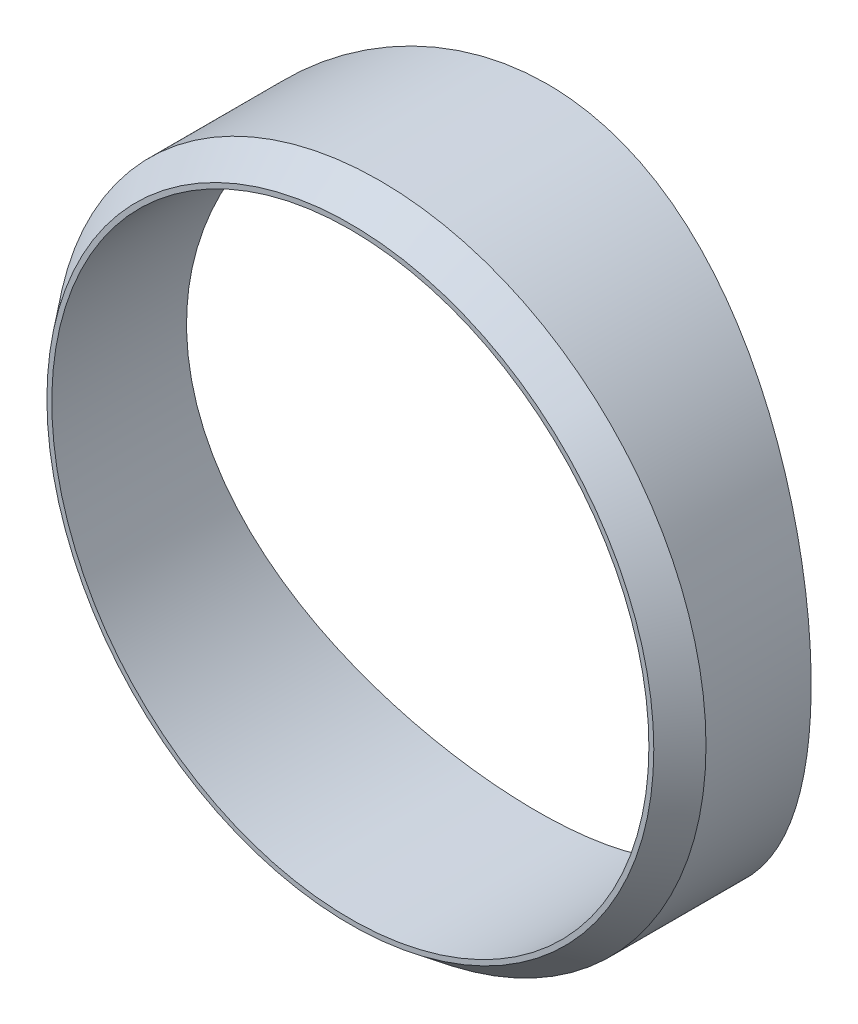
ISO-10303-21;
HEADER;
FILE_DESCRIPTION(('STEP AP214'),'2;1');
FILE_NAME('part.step','',(''),(''),'','','');
FILE_SCHEMA(('AUTOMOTIVE_DESIGN { 1 0 10303 214 1 1 1 1 }'));
ENDSEC;
DATA;
#1=APPLICATION_CONTEXT('core data for automotive mechanical design processes');
#2=APPLICATION_PROTOCOL_DEFINITION('international standard','automotive_design',2000,#1);
#3=PRODUCT_CONTEXT('',#1,'mechanical');
#4=PRODUCT('Part','Part','',(#3));
#5=PRODUCT_RELATED_PRODUCT_CATEGORY('part','',(#4));
#6=PRODUCT_DEFINITION_FORMATION('','',#4);
#7=PRODUCT_DEFINITION_CONTEXT('part definition',#1,'design');
#8=PRODUCT_DEFINITION('design','',#6,#7);
#9=PRODUCT_DEFINITION_SHAPE('','',#8);
#10=(LENGTH_UNIT() NAMED_UNIT(*) SI_UNIT(.MILLI.,.METRE.));
#11=(NAMED_UNIT(*) PLANE_ANGLE_UNIT() SI_UNIT($,.RADIAN.));
#12=(NAMED_UNIT(*) SI_UNIT($,.STERADIAN.) SOLID_ANGLE_UNIT());
#13=UNCERTAINTY_MEASURE_WITH_UNIT(LENGTH_MEASURE(1.E-05),#10,'distance_accuracy_value','');
#14=(GEOMETRIC_REPRESENTATION_CONTEXT(3) GLOBAL_UNCERTAINTY_ASSIGNED_CONTEXT((#13)) GLOBAL_UNIT_ASSIGNED_CONTEXT((#10,
#11,#12)) REPRESENTATION_CONTEXT('',''));
#15=CARTESIAN_POINT('',(0.,0.,0.));
#16=DIRECTION('',(0.,0.,1.));
#17=DIRECTION('',(1.,0.,0.));
#18=AXIS2_PLACEMENT_3D('',#15,#16,#17);
#19=CARTESIAN_POINT('',(0.,0.,25.4));
#20=DIRECTION('',(0.,0.,1.));
#21=DIRECTION('',(1.,0.,0.));
#22=AXIS2_PLACEMENT_3D('',#19,#20,#21);
#23=PLANE('',#22);
#24=CARTESIAN_POINT('',(0.,0.,25.4));
#25=DIRECTION('',(0.,0.,1.));
#26=DIRECTION('',(1.,0.,0.));
#27=AXIS2_PLACEMENT_3D('',#24,#25,#26);
#28=CIRCLE('',#27,78.2904683516004);
#29=CARTESIAN_POINT('',(78.2904683516004,0.,25.4));
#30=VERTEX_POINT('',#29);
#31=EDGE_CURVE('E48',#30,#30,#28,.T.);
#32=ORIENTED_EDGE('',*,*,#31,.T.);
#33=EDGE_LOOP('',(#32));
#34=FACE_BOUND('',#33,.T.);
#35=CARTESIAN_POINT('',(0.,0.,25.4));
#36=DIRECTION('',(0.,0.,1.));
#37=DIRECTION('',(1.,0.,0.));
#38=AXIS2_PLACEMENT_3D('',#35,#36,#37);
#39=CIRCLE('',#38,77.0255);
#40=CARTESIAN_POINT('',(77.0255,0.,25.4));
#41=VERTEX_POINT('',#40);
#42=EDGE_CURVE('E52',#41,#41,#39,.T.);
#43=ORIENTED_EDGE('',*,*,#42,.F.);
#44=EDGE_LOOP('',(#43));
#45=FACE_BOUND('',#44,.T.);
#46=ADVANCED_FACE('F33',(#34,#45),#23,.T.);
#47=CARTESIAN_POINT('',(0.,0.,25.4));
#48=DIRECTION('',(0.,0.,-1.));
#49=DIRECTION('',(-1.,0.,0.));
#50=AXIS2_PLACEMENT_3D('',#47,#48,#49);
#51=CYLINDRICAL_SURFACE('',#50,84.1375);
#52=CARTESIAN_POINT('',(0.,0.,17.78));
#53=DIRECTION('',(0.,0.,1.));
#54=DIRECTION('',(1.,0.,0.));
#55=AXIS2_PLACEMENT_3D('',#52,#53,#54);
#56=CIRCLE('',#55,84.1375);
#57=CARTESIAN_POINT('',(84.1375,0.,17.78));
#58=VERTEX_POINT('',#57);
#59=EDGE_CURVE('E44',#58,#58,#56,.F.);
#60=ORIENTED_EDGE('',*,*,#59,.T.);
#61=EDGE_LOOP('',(#60));
#62=FACE_BOUND('',#61,.T.);
#63=CARTESIAN_POINT('',(0.,84.1375,-25.4));
#64=CARTESIAN_POINT('',(-1.13579836737406,84.1374987840637,-25.3999989112412));
#65=CARTESIAN_POINT('',(-2.27166347939818,84.1144942440966,-25.3908888684016));
#66=CARTESIAN_POINT('',(-4.5413655448755,84.0225280340937,-25.3545196277505));
#67=CARTESIAN_POINT('',(-5.67520218700877,83.9535598304427,-25.3272578497176));
#68=CARTESIAN_POINT('',(-7.93906733420635,83.7698055382193,-25.2547956784839));
#69=CARTESIAN_POINT('',(-9.06909404595136,83.6550002770221,-25.2095877788638));
#70=CARTESIAN_POINT('',(-11.3228582922426,83.3798580755251,-25.1016017909872));
#71=CARTESIAN_POINT('',(-12.4465951722919,83.2195164835045,-25.0388219076908));
#72=CARTESIAN_POINT('',(-14.687826825913,82.8533553916742,-24.8960668968613));
#73=CARTESIAN_POINT('',(-15.8053048243469,82.6474464311462,-24.8160579525927));
#74=CARTESIAN_POINT('',(-18.0298682211291,82.1908279167666,-24.6395588016407));
#75=CARTESIAN_POINT('',(-19.1369525737826,81.9401139049008,-24.5430669549833));
#76=CARTESIAN_POINT('',(-21.3384219862647,81.3945721825672,-24.334402338982));
#77=CARTESIAN_POINT('',(-22.4328099576857,81.0997548105296,-24.222233245003));
#78=CARTESIAN_POINT('',(-24.6073995213569,80.4666226235838,-23.9830641617644));
#79=CARTESIAN_POINT('',(-25.6875997343616,80.1283036137102,-23.8560627422972));
#80=CARTESIAN_POINT('',(-27.8283473590047,79.4101527096415,-23.5886603390106));
#81=CARTESIAN_POINT('',(-28.8889484330848,79.0304634974695,-23.4483056094626));
#82=CARTESIAN_POINT('',(-30.9926172364742,78.2294287763831,-23.1548751080098));
#83=CARTESIAN_POINT('',(-32.035683322252,77.8080793879044,-23.0017981515717));
#84=CARTESIAN_POINT('',(-34.1025422857283,76.924628009252,-22.6840569488801));
#85=CARTESIAN_POINT('',(-35.1263364968086,76.4625288511407,-22.5193935080345));
#86=CARTESIAN_POINT('',(-37.1532401623122,75.4984477943863,-22.1796436481665));
#87=CARTESIAN_POINT('',(-38.1563477289527,74.9964622759767,-22.0045562835146));
#88=CARTESIAN_POINT('',(-41.1317129614006,73.432412175596,-21.4656034123779));
#89=CARTESIAN_POINT('',(-43.0711097442513,72.3117847619165,-21.0878764904726));
#90=CARTESIAN_POINT('',(-46.8504229710171,69.922506389119,-20.3057673209889));
#91=CARTESIAN_POINT('',(-48.6903370352126,68.653851891345,-19.901384436288));
#92=CARTESIAN_POINT('',(-52.3393653427279,65.9176320858619,-19.0582810971339));
#93=CARTESIAN_POINT('',(-54.1436155400303,64.4437950791801,-18.6188323602827));
#94=CARTESIAN_POINT('',(-57.6230027707126,61.3524634359866,-17.7341223746852));
#95=CARTESIAN_POINT('',(-59.2981362769925,59.7349648776468,-17.2888609675415));
#96=CARTESIAN_POINT('',(-62.5098428824084,56.3653875694754,-16.4041984293871));
#97=CARTESIAN_POINT('',(-64.0463773765926,54.6132715738148,-15.9647989600051));
#98=CARTESIAN_POINT('',(-66.970745032512,50.9849730169014,-15.1034937234226));
#99=CARTESIAN_POINT('',(-68.3585764162773,49.1087889726618,-14.6815881654253));
#100=CARTESIAN_POINT('',(-71.0189275265081,45.1800905052203,-13.8529946686391));
#101=CARTESIAN_POINT('',(-72.286202378091,43.123818821571,-13.4472534476534));
#102=CARTESIAN_POINT('',(-74.6421793061311,38.9037758076143,-12.6776376927333));
#103=CARTESIAN_POINT('',(-75.7308763561487,36.7400014536559,-12.3137643373422));
#104=CARTESIAN_POINT('',(-77.7199345214605,32.3202929751587,-11.6384254032149));
#105=CARTESIAN_POINT('',(-78.6203457330794,30.0643835559886,-11.3269458886218));
#106=CARTESIAN_POINT('',(-80.2245736291031,25.4762971916758,-10.7654331735866));
#107=CARTESIAN_POINT('',(-80.928400762305,23.1441243074365,-10.5153967074209));
#108=CARTESIAN_POINT('',(-82.1071360001626,18.5200050119321,-10.0932510716333));
#109=CARTESIAN_POINT('',(-82.5903644747553,16.2304350304875,-9.91832768147827));
#110=CARTESIAN_POINT('',(-83.3647917783705,11.6148830325373,-9.63670374553288));
#111=CARTESIAN_POINT('',(-83.6559954776382,9.28890194104357,-9.53000146948064));
#112=CARTESIAN_POINT('',(-84.043259569311,4.61920656207157,-9.38788884352235));
#113=CARTESIAN_POINT('',(-84.1393724712354,2.27549721673988,-9.35245931027685));
#114=CARTESIAN_POINT('',(-84.1355724006608,-2.41170802730963,-9.35385871613906));
#115=CARTESIAN_POINT('',(-84.0356651067709,-4.75520393024392,-9.39068556201487));
#116=CARTESIAN_POINT('',(-83.650367000701,-9.31187473144274,-9.53205712091199));
#117=CARTESIAN_POINT('',(-83.374062677545,-11.5259282506201,-9.63328366028779));
#118=CARTESIAN_POINT('',(-82.6473759889379,-15.9214309689536,-9.8976395519719));
#119=CARTESIAN_POINT('',(-82.1970001883284,-18.1028813944638,-10.0607665697934));
#120=CARTESIAN_POINT('',(-81.1262784370296,-22.4184991885229,-10.4447651179993));
#121=CARTESIAN_POINT('',(-80.5059254134601,-24.5526645855112,-10.6656390512589));
#122=CARTESIAN_POINT('',(-79.1006217724851,-28.7598641521006,-11.1595929272724));
#123=CARTESIAN_POINT('',(-78.3156669773701,-30.8328967685848,-11.43267419507));
#124=CARTESIAN_POINT('',(-76.5750961739525,-34.9343300603699,-12.0285851607627));
#125=CARTESIAN_POINT('',(-75.6171943980202,-36.961664494246,-12.3520720677581));
#126=CARTESIAN_POINT('',(-73.5458844249812,-40.9283319176619,-13.0378680753494));
#127=CARTESIAN_POINT('',(-72.4324756422538,-42.8676645757611,-13.4001773221444));
#128=CARTESIAN_POINT('',(-70.0576808925509,-46.647869919291,-14.1549086565952));
#129=CARTESIAN_POINT('',(-68.7962635896192,-48.4887216340615,-14.5473371149027));
#130=CARTESIAN_POINT('',(-66.1337110568633,-52.0616516468965,-15.3528368594222));
#131=CARTESIAN_POINT('',(-64.7325708619257,-53.793726075946,-15.7659088789519));
#132=CARTESIAN_POINT('',(-61.7159288217967,-57.2345058220655,-16.6264869294176));
#133=CARTESIAN_POINT('',(-60.0927896938098,-58.9363668857597,-17.0746201497227));
#134=CARTESIAN_POINT('',(-56.709858338175,-62.1983392798318,-17.970902553977));
#135=CARTESIAN_POINT('',(-54.9500602010555,-63.7584444739998,-18.4190517377781));
#136=CARTESIAN_POINT('',(-51.3029810974419,-66.7282093995578,-19.3034111053287));
#137=CARTESIAN_POINT('',(-49.4156355895307,-68.1377920186662,-19.7396150853114));
#138=CARTESIAN_POINT('',(-46.4986297626232,-70.1311969166396,-20.3754339818483));
#139=CARTESIAN_POINT('',(-45.5118379767763,-70.775574722811,-20.5843167155275));
#140=CARTESIAN_POINT('',(-43.5109337707891,-72.0229607580395,-20.9944338117443));
#141=CARTESIAN_POINT('',(-42.4968239288505,-72.6259728721568,-21.1956688917545));
#142=CARTESIAN_POINT('',(-40.4208288949557,-73.8019586117516,-21.5932070556042));
#143=CARTESIAN_POINT('',(-39.3583857690624,-74.3740137274549,-21.789312550928));
#144=CARTESIAN_POINT('',(-37.2083910011222,-75.4725889035402,-22.1704194159273));
#145=CARTESIAN_POINT('',(-36.1208418791483,-75.9991135091903,-22.3554218934412));
#146=CARTESIAN_POINT('',(-33.9220893424511,-77.0056688048626,-22.7128824055031));
#147=CARTESIAN_POINT('',(-32.8108803562794,-77.4856883927809,-22.8853374421762));
#148=CARTESIAN_POINT('',(-30.567100128933,-78.3979451761015,-23.2161990531302));
#149=CARTESIAN_POINT('',(-29.4345312279917,-78.8301875708714,-23.3746071557012));
#150=CARTESIAN_POINT('',(-27.1516354210934,-79.6453038220187,-23.6758189545095));
#151=CARTESIAN_POINT('',(-26.0013372819479,-80.028249806583,-23.8186454012916));
#152=CARTESIAN_POINT('',(-23.6836119518397,-80.744513572846,-24.0877007515908));
#153=CARTESIAN_POINT('',(-22.5161866812279,-81.0778368723877,-24.2139315003001));
#154=CARTESIAN_POINT('',(-20.1667514082667,-81.6939125844686,-24.4486447153511));
#155=CARTESIAN_POINT('',(-18.9847468031049,-81.9766831442725,-24.5571335494328));
#156=CARTESIAN_POINT('',(-16.6082269031161,-82.4909910284157,-24.7554181564164));
#157=CARTESIAN_POINT('',(-15.413713077128,-82.7225342987846,-24.8452160987267));
#158=CARTESIAN_POINT('',(-13.0418493613665,-83.1290781772235,-25.0034767709064));
#159=CARTESIAN_POINT('',(-11.864729083103,-83.3052475841439,-25.0723792599091));
#160=CARTESIAN_POINT('',(-9.50332142450741,-83.6075501353561,-25.1909249271593));
#161=CARTESIAN_POINT('',(-8.31903533426058,-83.7336920292335,-25.2405714731506));
#162=CARTESIAN_POINT('',(-5.94682866392396,-83.9355083362186,-25.3201264868808));
#163=CARTESIAN_POINT('',(-4.75891356764466,-84.0112385356098,-25.3500567725246));
#164=CARTESIAN_POINT('',(-2.38067415004954,-84.1122336870929,-25.3899933759974));
#165=CARTESIAN_POINT('',(-1.19034994515306,-84.1375010221249,-25.4000006346247));
#166=CARTESIAN_POINT('',(1.2064754251597,-84.1374989640286,-25.3999993567782));
#167=CARTESIAN_POINT('',(2.41297729269802,-84.1115403209579,-25.389717833034));
#168=CARTESIAN_POINT('',(4.22091326998973,-84.0337252292689,-25.3589494076985));
#169=CARTESIAN_POINT('',(4.82338211423127,-84.001296449053,-25.3461312716307));
#170=CARTESIAN_POINT('',(6.0274540845004,-83.923493200343,-25.315407506633));
#171=CARTESIAN_POINT('',(6.62905705380394,-83.8781166273751,-25.2975010506733));
#172=CARTESIAN_POINT('',(8.33085195885286,-83.7313351166958,-25.2396464044549));
#173=CARTESIAN_POINT('',(9.42957198024638,-83.6147196715556,-25.1937525161567));
#174=CARTESIAN_POINT('',(11.6208774826451,-83.3384300515371,-25.0853776220322));
#175=CARTESIAN_POINT('',(12.7134621155921,-83.1787500667184,-25.0228943781138));
#176=CARTESIAN_POINT('',(14.8909521759895,-82.8166472694777,-24.8817976516025));
#177=CARTESIAN_POINT('',(15.9758542094698,-82.6142066523683,-24.8031774502842));
#178=CARTESIAN_POINT('',(18.1357676783897,-82.1670813544746,-24.6304164433531));
#179=CARTESIAN_POINT('',(19.2107782085816,-81.9223928469758,-24.536274231828));
#180=CARTESIAN_POINT('',(21.3510842162468,-81.3908367030825,-24.3329887472587));
#181=CARTESIAN_POINT('',(22.416357186758,-81.1038893092892,-24.2238171344195));
#182=CARTESIAN_POINT('',(24.5333923696353,-80.4887981539502,-23.9914199535691));
#183=CARTESIAN_POINT('',(25.5851544990723,-80.1606541396745,-23.8681942993407));
#184=CARTESIAN_POINT('',(27.6734342288918,-79.4639002111979,-23.608597393834));
#185=CARTESIAN_POINT('',(28.7099531665223,-79.095293870963,-23.4722273037101));
#186=CARTESIAN_POINT('',(30.766204241882,-78.3183723875131,-23.1873142711305));
#187=CARTESIAN_POINT('',(31.785937630837,-77.9100602198606,-23.0387722409733));
#188=CARTESIAN_POINT('',(33.8251383343548,-77.0469103034505,-22.727807088882));
#189=CARTESIAN_POINT('',(34.8442804421776,-76.5913760691221,-22.5651845656317));
#190=CARTESIAN_POINT('',(36.8621852871375,-75.6408754336677,-22.2295480248669));
#191=CARTESIAN_POINT('',(37.8609490715736,-75.1459110654109,-22.0565345431841));
#192=CARTESIAN_POINT('',(39.8367149341125,-74.1174422168748,-21.7013033241531));
#193=CARTESIAN_POINT('',(40.8137179949538,-73.5839394816671,-21.51908600368));
#194=CARTESIAN_POINT('',(42.7448094892143,-72.4792253130799,-21.1466412752471));
#195=CARTESIAN_POINT('',(43.6988930473624,-71.908005952079,-20.9564121863638));
#196=CARTESIAN_POINT('',(46.5239121673113,-70.1397052293876,-20.3757580073506));
#197=CARTESIAN_POINT('',(48.3586268299631,-68.8874546501574,-19.9751822432552));
#198=CARTESIAN_POINT('',(51.9210186787804,-66.2438456532081,-19.1572933852868));
#199=CARTESIAN_POINT('',(53.6486912155191,-64.8524811998613,-18.7399795656834));
#200=CARTESIAN_POINT('',(56.2071057569245,-62.6200685580884,-18.095605597421));
#201=CARTESIAN_POINT('',(57.0796232857716,-61.8257823559038,-17.8707933365855));
#202=CARTESIAN_POINT('',(58.790303962265,-60.2014096331592,-17.4209285905839));
#203=CARTESIAN_POINT('',(59.6284749216728,-59.3713313422621,-17.195876172121));
#204=CARTESIAN_POINT('',(61.269435342197,-57.6763978919289,-16.7469965149714));
#205=CARTESIAN_POINT('',(62.0722202084451,-56.8115382438691,-16.5231694386803));
#206=CARTESIAN_POINT('',(63.6410942462141,-55.0483660732008,-16.0782650192627));
#207=CARTESIAN_POINT('',(64.4071812034094,-54.1500515377468,-15.8571878426577));
#208=CARTESIAN_POINT('',(65.9014846936324,-52.3211991227096,-15.4192494654582));
#209=CARTESIAN_POINT('',(66.6296947491209,-51.3906557765316,-15.2023889899302));
#210=CARTESIAN_POINT('',(68.0469326831533,-49.4987968360999,-14.7743645899035));
#211=CARTESIAN_POINT('',(68.7359573129536,-48.5374787006988,-14.5632011384885));
#212=CARTESIAN_POINT('',(70.0735159391062,-46.5856297456182,-14.1480225645822));
#213=CARTESIAN_POINT('',(70.7220515988819,-45.5951001285098,-13.944007148577));
#214=CARTESIAN_POINT('',(71.9774631335714,-43.5863111639921,-13.5444989246959));
#215=CARTESIAN_POINT('',(72.5843391654383,-42.5680519210747,-13.3490060847121));
#216=CARTESIAN_POINT('',(73.7637580593547,-40.4904236201499,-12.9651099232105));
#217=CARTESIAN_POINT('',(74.3356749779068,-39.430672443693,-12.7768506290644));
#218=CARTESIAN_POINT('',(75.4341795052027,-37.2861204580077,-12.4118263212716));
#219=CARTESIAN_POINT('',(75.9607714136656,-36.2013220372748,-12.2350602177232));
#220=CARTESIAN_POINT('',(76.9675989808587,-34.0082866605201,-11.8942451356092));
#221=CARTESIAN_POINT('',(77.4478287327534,-32.9000467397715,-11.7301977780161));
#222=CARTESIAN_POINT('',(78.3607052599883,-30.6623349026154,-11.4160491145323));
#223=CARTESIAN_POINT('',(78.793357208823,-29.5328653103407,-11.2659462926226));
#224=CARTESIAN_POINT('',(79.6100026396272,-27.2549081432356,-10.9807998123428));
#225=CARTESIAN_POINT('',(79.9940079628619,-26.1064252737579,-10.8457524902186));
#226=CARTESIAN_POINT('',(80.7124888964821,-23.7924473810083,-10.5916876684995));
#227=CARTESIAN_POINT('',(81.0469696582554,-22.6269541409752,-10.4726685018233));
#228=CARTESIAN_POINT('',(81.6655863305325,-20.2810841339025,-10.2515335282699));
#229=CARTESIAN_POINT('',(81.9497218655443,-19.100707255926,-10.149417847465));
#230=CARTESIAN_POINT('',(82.4668835636429,-16.7274309059156,-9.96286444334243));
#231=CARTESIAN_POINT('',(82.6999103285937,-15.5345315815211,-9.87842651184963));
#232=CARTESIAN_POINT('',(83.1035324540777,-13.2004281866834,-9.73175474896208));
#233=CARTESIAN_POINT('',(83.2767277393433,-12.0597307842497,-9.66860038944896));
#234=CARTESIAN_POINT('',(83.57615030259,-9.77127272290287,-9.55920290470898));
#235=CARTESIAN_POINT('',(83.7023734645743,-8.62351145396255,-9.51296126148824));
#236=CARTESIAN_POINT('',(83.9074919630852,-6.32334896358762,-9.43772444696079));
#237=CARTESIAN_POINT('',(83.9863932230448,-5.17094834106291,-9.40872711713241));
#238=CARTESIAN_POINT('',(84.0966933838927,-2.8634540447277,-9.36817058195371));
#239=CARTESIAN_POINT('',(84.1280875832586,-1.70836011570275,-9.35661310253336));
#240=CARTESIAN_POINT('',(84.1432747714452,0.601907962464761,-9.35102347673595));
#241=CARTESIAN_POINT('',(84.127079089475,1.75708202706065,-9.35698715928496));
#242=CARTESIAN_POINT('',(84.0471531366509,4.06556686782429,-9.38638911474745));
#243=CARTESIAN_POINT('',(83.9834226378726,5.21887763503115,-9.40982747145011));
#244=CARTESIAN_POINT('',(83.8085946146548,7.52139596202885,-9.47401411116958));
#245=CARTESIAN_POINT('',(83.6974979754726,8.6706035981011,-9.51476207067562));
#246=CARTESIAN_POINT('',(83.4282235462257,10.962756553736,-9.61328402789944));
#247=CARTESIAN_POINT('',(83.2700457628858,12.105701874193,-9.67105802318536));
#248=CARTESIAN_POINT('',(82.9137059458647,14.3411901522644,-9.80079352646058));
#249=CARTESIAN_POINT('',(82.7172330357099,15.4340378088037,-9.87215344670397));
#250=CARTESIAN_POINT('',(82.2814238557938,17.61015758173,-10.029844802115));
#251=CARTESIAN_POINT('',(82.042084034607,18.69342889693,-10.1161774777223));
#252=CARTESIAN_POINT('',(81.5211240039484,20.8483540820473,-10.3032517333322));
#253=CARTESIAN_POINT('',(81.239509013617,21.9200093685512,-10.4039915346103));
#254=CARTESIAN_POINT('',(80.634569870303,24.0501789114883,-10.6192643221436));
#255=CARTESIAN_POINT('',(80.3112418907098,25.1086919525174,-10.7337985737915));
#256=CARTESIAN_POINT('',(79.6235752297204,27.2108063051721,-10.9759446799994));
#257=CARTESIAN_POINT('',(79.2592366622794,28.2544076582234,-11.103556498221));
#258=CARTESIAN_POINT('',(78.4903006905153,30.3251031801363,-11.3710695276365));
#259=CARTESIAN_POINT('',(78.085699724053,31.3521958790723,-11.5109718260787));
#260=CARTESIAN_POINT('',(76.8127197486863,34.4062171367643,-11.9478435503395));
#261=CARTESIAN_POINT('',(75.8850125264679,36.4063502180648,-12.2620315085854));
#262=CARTESIAN_POINT('',(73.8496307870749,40.3791717188042,-12.9383454063673));
#263=CARTESIAN_POINT('',(72.7375216548759,42.3493869428777,-13.3015963177496));
#264=CARTESIAN_POINT('',(70.3614395019796,46.189660605753,-14.0596344974458));
#265=CARTESIAN_POINT('',(69.0974643225119,48.0597176202629,-14.4544222140275));
#266=CARTESIAN_POINT('',(66.4257269613256,51.6896695943338,-15.2659280173345));
#267=CARTESIAN_POINT('',(65.0179324634176,53.4495396509794,-15.6826510226753));
#268=CARTESIAN_POINT('',(62.0673050973267,56.8492274279432,-16.5277801778101));
#269=CARTESIAN_POINT('',(60.5244679689937,58.4890413578871,-16.9561866958868));
#270=CARTESIAN_POINT('',(57.2231109825551,61.7274260080137,-17.8380512526608));
#271=CARTESIAN_POINT('',(55.4573646479106,63.3186140940334,-18.2915757486493));
#272=CARTESIAN_POINT('',(51.7955361336954,66.3474604928405,-19.1873630085978));
#273=CARTESIAN_POINT('',(49.8994476974666,67.7851114270951,-19.6296252305498));
#274=CARTESIAN_POINT('',(46.9662422985571,69.8191184342494,-20.2750437090292));
#275=CARTESIAN_POINT('',(45.973216726005,70.4769650108824,-20.4872745453053));
#276=CARTESIAN_POINT('',(43.9590169239977,71.7505603694797,-20.9041546027418));
#277=CARTESIAN_POINT('',(42.9378454344397,72.3663132289388,-21.1088045573576));
#278=CARTESIAN_POINT('',(40.8688558566642,73.5545983763756,-21.5089893429343));
#279=CARTESIAN_POINT('',(39.8210362908345,74.1271282606619,-21.7045236667309));
#280=CARTESIAN_POINT('',(37.7005470018114,75.2277502965145,-22.0849377263878));
#281=CARTESIAN_POINT('',(36.6278798045674,75.7558469399919,-22.2698185386518));
#282=CARTESIAN_POINT('',(34.4551078646593,76.768526557683,-22.6281782406268));
#283=CARTESIAN_POINT('',(33.3549123408878,77.2529315715017,-22.8016097902029));
#284=CARTESIAN_POINT('',(31.1331181552372,78.1747672075468,-23.1348396400622));
#285=CARTESIAN_POINT('',(30.0115217598515,78.6122027719836,-23.2946393743451));
#286=CARTESIAN_POINT('',(27.7484786574042,79.4392381480523,-23.5993251788598));
#287=CARTESIAN_POINT('',(26.6070266618078,79.8288249853754,-23.744207202401));
#288=CARTESIAN_POINT('',(24.3067777201468,80.5590179092085,-24.0177458886759));
#289=CARTESIAN_POINT('',(23.1479827004696,80.8996293917564,-24.1464043387085));
#290=CARTESIAN_POINT('',(20.8179497033487,81.5302706311923,-24.3860902940861));
#291=CARTESIAN_POINT('',(19.6467487276985,81.8204210814626,-24.4971598102905));
#292=CARTESIAN_POINT('',(17.2915616363778,82.3503340866718,-24.7010372909377));
#293=CARTESIAN_POINT('',(16.1075770048952,82.5901024262429,-24.7938473517655));
#294=CARTESIAN_POINT('',(13.7296749684394,83.018514559638,-24.9603343741803));
#295=CARTESIAN_POINT('',(12.5357627677854,83.2071835898626,-25.0340207796075));
#296=CARTESIAN_POINT('',(10.1400273985273,83.5329860317132,-25.161628940216));
#297=CARTESIAN_POINT('',(8.93820556772362,83.6701279414951,-25.2155539545262));
#298=CARTESIAN_POINT('',(7.09125256306478,83.8406193033496,-25.2827126348354));
#299=CARTESIAN_POINT('',(6.44803760011521,83.8925398421037,-25.3031923517002));
#300=CARTESIAN_POINT('',(5.16055189342456,83.9815685695581,-25.3383364170313));
#301=CARTESIAN_POINT('',(4.51628140760766,84.0186799538141,-25.3530020200769));
#302=CARTESIAN_POINT('',(3.22693987292511,84.0780723919732,-25.3764832594961));
#303=CARTESIAN_POINT('',(2.58186881042704,84.1003531897673,-25.385298794845));
#304=CARTESIAN_POINT('',(1.29120574125024,84.1300689060951,-25.3970580942008));
#305=CARTESIAN_POINT('',(0.645613653371668,84.1375006911659,-25.4000006188753));
#306=CARTESIAN_POINT('',(0.,84.1375,-25.4));
#307=B_SPLINE_CURVE_WITH_KNOTS('',3,(#63,#64,#65,#66,#67,#68,#69,#70,#71,#72,#73,#74,#75,#76,
#77,#78,#79,#80,#81,#82,#83,#84,#85,#86,#87,#88,#89,#90,#91,#92,#93,#94,#95,#96,#97,#98,#99,
#100,#101,#102,#103,#104,#105,#106,#107,#108,#109,#110,#111,#112,#113,#114,#115,#116,#117,#118,
#119,#120,#121,#122,#123,#124,#125,#126,#127,#128,#129,#130,#131,#132,#133,#134,#135,#136,#137,
#138,#139,#140,#141,#142,#143,#144,#145,#146,#147,#148,#149,#150,#151,#152,#153,#154,#155,#156,
#157,#158,#159,#160,#161,#162,#163,#164,#165,#166,#167,#168,#169,#170,#171,#172,#173,#174,#175,
#176,#177,#178,#179,#180,#181,#182,#183,#184,#185,#186,#187,#188,#189,#190,#191,#192,#193,#194,
#195,#196,#197,#198,#199,#200,#201,#202,#203,#204,#205,#206,#207,#208,#209,#210,#211,#212,#213,
#214,#215,#216,#217,#218,#219,#220,#221,#222,#223,#224,#225,#226,#227,#228,#229,#230,#231,#232,
#233,#234,#235,#236,#237,#238,#239,#240,#241,#242,#243,#244,#245,#246,#247,#248,#249,#250,#251,
#252,#253,#254,#255,#256,#257,#258,#259,#260,#261,#262,#263,#264,#265,#266,#267,#268,#269,#270,
#271,#272,#273,#274,#275,#276,#277,#278,#279,#280,#281,#282,#283,#284,#285,#286,#287,#288,#289,
#290,#291,#292,#293,#294,#295,#296,#297,#298,#299,#300,#301,#302,#303,#304,#305,#306),
.UNSPECIFIED.,.T.,.F.,(4,2,2,2,2,2,2,2,2,2,2,2,2,2,2,2,2,2,2,2,2,2,2,2,2,2,2,2,2,2,2,2,2,2,2,2,
2,2,2,2,2,2,2,2,2,2,2,2,2,2,2,2,2,2,2,2,2,2,2,2,2,2,2,2,2,2,2,2,2,2,2,2,2,2,2,2,2,2,2,2,2,2,2,2,
2,2,2,2,2,2,2,2,2,2,2,2,2,2,2,2,2,2,2,2,2,2,2,2,2,2,2,2,2,2,2,2,2,2,2,2,2,4),(0.,
3.40724162974607,6.81496769335498,10.2241206290028,13.633621948785,17.0498773554364,
20.4664728621974,23.8822687236627,27.2983942257514,30.703089981468,34.1081030953926,
37.512879751016,40.9179657505746,47.7245335481421,54.531264093206,61.6356060419593,
68.7401419923496,75.8466507473254,82.9532444618439,90.2918853628401,97.6307327895487,
104.967625112308,112.304127391817,119.334769741516,126.365233769069,133.393805266222,
140.422173152109,147.114869579132,153.807313625889,160.500036192581,167.192928645877,
173.9817926811,180.770682283057,187.561011812347,194.351582724982,201.525656097327,
208.70003986718,215.87808159653,219.467975803356,223.057532384879,226.723875309879,
230.389851803739,234.056701327611,237.723151411773,241.384174422922,245.044790038479,
248.704088927451,252.362962852932,255.938415120995,259.513241782583,263.084105885526,
266.654801362353,270.273868478761,272.084162489878,273.894750905514,277.211222329395,
280.52814141042,283.846444323543,287.165047958554,290.48999720006,293.814966840218,
297.139643027608,300.464070254835,303.84743347018,307.230622364818,310.613658159803,
313.997407309463,320.761452452161,327.525791188785,331.128311319256,334.730007494991,
338.332169979903,341.934549543647,345.53754315833,349.140835052028,352.743978812811,
356.347108997972,360.002520426145,363.657584703715,367.313114047008,370.968245503066,
374.622485532737,378.276345192517,381.930232102896,385.584075982274,389.049485070231,
392.515197747962,395.98047652083,399.446098211568,402.910894946011,406.375708293887,
409.84045688839,413.305204988013,416.642216021004,419.979503645719,423.316379599229,
426.653561884568,429.99073489718,433.328203422769,440.001679443345,446.86846231873,
453.735342816739,460.603769710297,467.472413358246,474.72357545492,481.975085863939,
485.603954823179,489.232471764978,492.861190345374,496.489541644091,500.132060630787,
503.774195968686,507.417316711056,511.060035751256,514.693918539531,518.327383874575,
521.959051465432,525.590119837108,527.526849693831,529.463161411958,531.399506567333,
533.336260290255),.UNSPECIFIED.);
#308=CARTESIAN_POINT('',(0.,84.1375,-25.4));
#309=VERTEX_POINT('',#308);
#310=EDGE_CURVE('E57',#309,#309,#307,.T.);
#311=ORIENTED_EDGE('',*,*,#310,.T.);
#312=EDGE_LOOP('',(#311));
#313=FACE_BOUND('',#312,.T.);
#314=ADVANCED_FACE('F61',(#62,#313),#51,.T.);
#315=CARTESIAN_POINT('',(0.,0.,25.4));
#316=DIRECTION('',(0.,0.,-1.));
#317=DIRECTION('',(-1.,0.,0.));
#318=AXIS2_PLACEMENT_3D('',#315,#316,#317);
#319=CYLINDRICAL_SURFACE('',#318,77.0255);
#320=CARTESIAN_POINT('',(0.,77.0255,-22.7206412170841));
#321=CARTESIAN_POINT('',(-1.04654689068996,77.0254997962299,-22.7206410267565));
#322=CARTESIAN_POINT('',(-2.09310252860421,77.0041660868149,-22.7130028156338));
#323=CARTESIAN_POINT('',(-4.18435303747885,76.9188801168985,-22.6825100993853));
#324=CARTESIAN_POINT('',(-5.22904771196818,76.8549235962207,-22.6596540732296));
#325=CARTESIAN_POINT('',(-7.31502897553495,76.6845069788102,-22.5988951957166));
#326=CARTESIAN_POINT('',(-8.35631369430053,76.5780265554153,-22.5609851485025));
#327=CARTESIAN_POINT('',(-10.4331496896885,76.3228127711037,-22.4704196857937));
#328=CARTESIAN_POINT('',(-11.4687003872287,76.17407521919,-22.4177628077384));
#329=CARTESIAN_POINT('',(-13.5342483478088,75.8343559956261,-22.298000663514));
#330=CARTESIAN_POINT('',(-14.5642293627287,75.6432861868782,-22.23086526047));
#331=CARTESIAN_POINT('',(-16.6146885783785,75.2195179665461,-22.0827375387727));
#332=CARTESIAN_POINT('',(-17.635165833516,74.9868154582326,-22.0017438564752));
#333=CARTESIAN_POINT('',(-19.6644783103211,74.480395487219,-21.826559933949));
#334=CARTESIAN_POINT('',(-20.6733163074478,74.2066880296292,-21.732372913227));
#335=CARTESIAN_POINT('',(-22.6779692242501,73.6188058601894,-21.5315050856003));
#336=CARTESIAN_POINT('',(-23.6737828852067,73.3046272684327,-21.4248230809097));
#337=CARTESIAN_POINT('',(-25.6476974150703,72.6374920544019,-21.2001136338878));
#338=CARTESIAN_POINT('',(-26.6258423107446,72.2846540772692,-21.0821210357536));
#339=CARTESIAN_POINT('',(-28.5659060661685,71.5401751845092,-20.835399785914));
#340=CARTESIAN_POINT('',(-29.5278234048985,71.1485306549065,-20.7066701344658));
#341=CARTESIAN_POINT('',(-32.386813697161,69.9165698975557,-20.3057727189941));
#342=CARTESIAN_POINT('',(-34.257577002065,69.0190735106979,-20.018844361171));
#343=CARTESIAN_POINT('',(-37.9158554676978,67.0790758002659,-19.4139332677642));
#344=CARTESIAN_POINT('',(-39.7033993529939,66.036625012926,-19.0959613665177));
#345=CARTESIAN_POINT('',(-43.1860346290831,63.8134898700291,-18.4374498166323));
#346=CARTESIAN_POINT('',(-44.8811242863233,62.6328029237951,-18.0969097450963));
#347=CARTESIAN_POINT('',(-48.2294051591805,60.0951303131321,-17.3894785874303));
#348=CARTESIAN_POINT('',(-49.8788024849053,58.7332792841239,-17.0220793174407));
#349=CARTESIAN_POINT('',(-53.058165823232,55.8777636242117,-16.2826494614846));
#350=CARTESIAN_POINT('',(-54.5881290053032,54.3840958711024,-15.9106187659978));
#351=CARTESIAN_POINT('',(-57.5196160693237,51.2736728707621,-15.1718083153667));
#352=CARTESIAN_POINT('',(-58.9211075723058,49.6568867807156,-14.8050299035117));
#353=CARTESIAN_POINT('',(-61.5862369040695,46.3102457608645,-14.0865594933301));
#354=CARTESIAN_POINT('',(-62.8498734564658,44.5803897843942,-13.7348676347067));
#355=CARTESIAN_POINT('',(-65.2625212374032,40.9703448195634,-13.0468214296689));
#356=CARTESIAN_POINT('',(-66.4075614737786,39.0873720676029,-12.7111291230086));
#357=CARTESIAN_POINT('',(-68.534286818668,35.2255351586321,-12.0749719698212));
#358=CARTESIAN_POINT('',(-69.5159681464184,33.2466687836368,-11.7745079386617));
#359=CARTESIAN_POINT('',(-71.3074483656186,29.2071218397321,-11.2174888119818));
#360=CARTESIAN_POINT('',(-72.117285968027,27.1464598212189,-10.9609238299208));
#361=CARTESIAN_POINT('',(-73.5579170603777,22.9578895277661,-10.4991238651918));
#362=CARTESIAN_POINT('',(-74.1887183994661,20.8299842053936,-10.2938866323059));
#363=CARTESIAN_POINT('',(-75.2460242877596,16.5996092446009,-9.94710477912635));
#364=CARTESIAN_POINT('',(-75.6789833228153,14.4989159047463,-9.8035586706558));
#365=CARTESIAN_POINT('',(-76.3684653413969,10.2656546693978,-9.573927220892));
#366=CARTESIAN_POINT('',(-76.6249921245894,8.1330874613543,-9.48784064214443));
#367=CARTESIAN_POINT('',(-76.9590141253554,3.85288873860187,-9.37559654884238));
#368=CARTESIAN_POINT('',(-77.0365498672257,1.70526074418195,-9.3494254691873));
#369=CARTESIAN_POINT('',(-77.0119162783832,-2.58882126775713,-9.35772602896723));
#370=CARTESIAN_POINT('',(-76.9097512102775,-4.73527531191495,-9.39219622995603));
#371=CARTESIAN_POINT('',(-76.5344691194465,-8.92449121298712,-9.51819555867807));
#372=CARTESIAN_POINT('',(-76.2683766649047,-10.9679576518424,-9.60737948781448));
#373=CARTESIAN_POINT('',(-75.5740600026939,-15.024060889544,-9.83834495411931));
#374=CARTESIAN_POINT('',(-75.1458409120749,-17.0366986593207,-9.98012483124859));
#375=CARTESIAN_POINT('',(-74.1310316936299,-21.0175508570875,-10.3126150564806));
#376=CARTESIAN_POINT('',(-73.5444346839196,-22.9857633506693,-10.5033275307992));
#377=CARTESIAN_POINT('',(-72.2177902469644,-26.8648573496842,-10.9288173476185));
#378=CARTESIAN_POINT('',(-71.477739368758,-28.7757375646886,-11.1635956810871));
#379=CARTESIAN_POINT('',(-69.8391988080905,-32.5531652847739,-11.6747090178097));
#380=CARTESIAN_POINT('',(-68.9387360238937,-34.4187873609333,-11.9515543736242));
#381=CARTESIAN_POINT('',(-66.9930046115033,-38.067573348059,-12.5374557991074));
#382=CARTESIAN_POINT('',(-65.94773539865,-39.8507369260584,-12.8465119988269));
#383=CARTESIAN_POINT('',(-63.7194506363938,-43.3245687055075,-13.4892033664703));
#384=CARTESIAN_POINT('',(-62.5364101349706,-45.0152200701409,-13.8228429827121));
#385=CARTESIAN_POINT('',(-60.0403615826369,-48.2941880102658,-14.506428573967));
#386=CARTESIAN_POINT('',(-58.727349571484,-49.8825014650769,-14.8563750456791));
#387=CARTESIAN_POINT('',(-55.9133361005941,-53.0214998328128,-15.5809426122143));
#388=CARTESIAN_POINT('',(-54.406339634366,-54.5667292364886,-15.9559422870479));
#389=CARTESIAN_POINT('',(-51.2678452299005,-57.5255419259355,-16.7041904959649));
#390=CARTESIAN_POINT('',(-49.6363425117499,-58.9391201528624,-17.0774389622333));
#391=CARTESIAN_POINT('',(-46.2577186569987,-61.6263791945693,-17.8120786309228));
#392=CARTESIAN_POINT('',(-44.5105435461641,-62.899993952763,-18.1734641786239));
#393=CARTESIAN_POINT('',(-41.8122558030952,-64.6980093666998,-18.698690219621));
#394=CARTESIAN_POINT('',(-40.8997908045167,-65.2786767328928,-18.870976646026));
#395=CARTESIAN_POINT('',(-39.0503138207713,-66.4015851573775,-19.2087017207019));
#396=CARTESIAN_POINT('',(-38.1133041740859,-66.943829858266,-19.3741410174832));
#397=CARTESIAN_POINT('',(-36.2014403849121,-67.99700765896,-19.6994536799448));
#398=CARTESIAN_POINT('',(-35.2262242779244,-68.5073224488743,-19.859200425421));
#399=CARTESIAN_POINT('',(-33.2536814366135,-69.4862031758823,-20.1691018973485));
#400=CARTESIAN_POINT('',(-32.2563569124532,-69.9547732628692,-20.3192575768388));
#401=CARTESIAN_POINT('',(-30.2409700818195,-70.8493272443255,-20.6088277390547));
#402=CARTESIAN_POINT('',(-29.2229029768177,-71.2753011469196,-20.7482396998533));
#403=CARTESIAN_POINT('',(-27.1681505295115,-72.0835481978738,-21.0151318996702));
#404=CARTESIAN_POINT('',(-26.13146717991,-72.4658259916275,-21.1426134067698));
#405=CARTESIAN_POINT('',(-24.0428111402896,-73.1853065092491,-21.3844190184951));
#406=CARTESIAN_POINT('',(-22.9908635863037,-73.5225756738498,-21.4987624817299));
#407=CARTESIAN_POINT('',(-20.8722360944607,-74.1518604598722,-21.7135314682301));
#408=CARTESIAN_POINT('',(-19.8055577679581,-74.443880988864,-21.8139585007169));
#409=CARTESIAN_POINT('',(-17.6597886637297,-74.9818812408099,-22.000009306254));
#410=CARTESIAN_POINT('',(-16.5807025440873,-75.2278776791332,-22.0856384528443));
#411=CARTESIAN_POINT('',(-14.4119732346024,-75.6732974292885,-22.241378790334));
#412=CARTESIAN_POINT('',(-13.3223313065565,-75.8727262377864,-22.3114918126466));
#413=CARTESIAN_POINT('',(-11.2184425144897,-76.2110277521924,-22.4308324919405));
#414=CARTESIAN_POINT('',(-10.2048195057585,-76.3533707212425,-22.4812491929534));
#415=CARTESIAN_POINT('',(-8.1722856737414,-76.5975776454184,-22.5679406829489));
#416=CARTESIAN_POINT('',(-7.1533758319294,-76.6994488594522,-22.6042180079109));
#417=CARTESIAN_POINT('',(-5.11295402995659,-76.8624206066265,-22.6623320893008));
#418=CARTESIAN_POINT('',(-4.09144588551317,-76.9235634951653,-22.684183847376));
#419=CARTESIAN_POINT('',(-2.0466380638462,-77.0051035114297,-22.7133387476375));
#420=CARTESIAN_POINT('',(-1.02333842403218,-77.0255014800579,-22.7206421900751));
#421=CARTESIAN_POINT('',(1.16200906762625,-77.0254983193822,-22.720640112245));
#422=CARTESIAN_POINT('',(2.32406814279499,-76.9991940253415,-22.7112208501678));
#423=CARTESIAN_POINT('',(4.06527800616091,-76.9203424331962,-22.6830359196234));
#424=CARTESIAN_POINT('',(4.64551072076628,-76.8874797718847,-22.6712936491916));
#425=CARTESIAN_POINT('',(5.80507101052843,-76.8086358019304,-22.6431508692433));
#426=CARTESIAN_POINT('',(6.38439842146653,-76.7626523406807,-22.6267495953698));
#427=CARTESIAN_POINT('',(7.98168260643019,-76.6176637276679,-22.575101242091));
#428=CARTESIAN_POINT('',(8.99827137348123,-76.5049262176445,-22.5350061971798));
#429=CARTESIAN_POINT('',(11.0256211952123,-76.2391549358914,-22.4408033248179));
#430=CARTESIAN_POINT('',(12.0363814609234,-76.0861158338237,-22.3866936437899));
#431=CARTESIAN_POINT('',(14.0506361102099,-75.7400285399177,-22.2648512077505));
#432=CARTESIAN_POINT('',(15.054127336247,-75.5469639276234,-22.1971128619205));
#433=CARTESIAN_POINT('',(17.0517959091063,-75.1212818761138,-22.0485314595812));
#434=CARTESIAN_POINT('',(18.0459724072116,-74.8886608689708,-21.9676872209707));
#435=CARTESIAN_POINT('',(20.0251078704634,-74.383920173554,-21.7933380094628));
#436=CARTESIAN_POINT('',(21.0100462368136,-74.1117277784476,-21.6998097531918));
#437=CARTESIAN_POINT('',(22.9672230365246,-73.528749016571,-21.5008956783529));
#438=CARTESIAN_POINT('',(23.9394614034403,-73.2179624479693,-21.3955097977748));
#439=CARTESIAN_POINT('',(25.8696082713575,-72.5584663021501,-21.1736526490004));
#440=CARTESIAN_POINT('',(26.8275180017051,-72.2097599997871,-21.0571823381949));
#441=CARTESIAN_POINT('',(28.7275417573799,-71.4751241605466,-20.8139854098728));
#442=CARTESIAN_POINT('',(29.669656987142,-71.0891974772639,-20.6872595787413));
#443=CARTESIAN_POINT('',(31.5513615123512,-70.2745098443243,-20.4223703964517));
#444=CARTESIAN_POINT('',(32.4906808073485,-69.845173325419,-20.284059150463));
#445=CARTESIAN_POINT('',(34.3501784021019,-68.9496757906087,-19.9987430545117));
#446=CARTESIAN_POINT('',(35.270357728672,-68.4835167566148,-19.8517386725497));
#447=CARTESIAN_POINT('',(37.0902498727235,-67.5152077542017,-19.5500494288469));
#448=CARTESIAN_POINT('',(37.9899636672575,-67.0130595087278,-19.395364934892));
#449=CARTESIAN_POINT('',(39.7678143779639,-65.9735509249446,-19.0793364969704));
#450=CARTESIAN_POINT('',(40.6459465425903,-65.4361829262537,-18.9179911070859));
#451=CARTESIAN_POINT('',(43.2451972475072,-63.7731118419894,-18.4257317198592));
#452=CARTESIAN_POINT('',(44.932159978505,-62.5959144989508,-18.0864285394156));
#453=CARTESIAN_POINT('',(48.2048701252347,-60.1118856788636,-17.394352479421));
#454=CARTESIAN_POINT('',(49.7906138853903,-58.8050495241897,-17.0415791141217));
#455=CARTESIAN_POINT('',(52.1276709110211,-56.7168761182863,-16.4995179849159));
#456=CARTESIAN_POINT('',(52.9188957204678,-55.979352057398,-16.3118264513949));
#457=CARTESIAN_POINT('',(54.4694547004426,-54.471781006215,-15.936509330963));
#458=CARTESIAN_POINT('',(55.2287962619623,-53.7017416373761,-15.7488837388786));
#459=CARTESIAN_POINT('',(56.7146323442451,-52.1301032529654,-15.3749271488753));
#460=CARTESIAN_POINT('',(57.4411227626427,-51.328500319072,-15.1885963150879));
#461=CARTESIAN_POINT('',(58.859985833497,-49.6950748520618,-14.8185230638593));
#462=CARTESIAN_POINT('',(59.5523563914623,-48.8632504691943,-14.6347808058144));
#463=CARTESIAN_POINT('',(61.5767134906058,-46.3240841083873,-14.0892742934503));
#464=CARTESIAN_POINT('',(62.8560214846431,-44.5729685036175,-13.7332109694867));
#465=CARTESIAN_POINT('',(65.2642917940234,-40.9658877335076,-13.0462181943482));
#466=CARTESIAN_POINT('',(66.3932552539603,-39.1099233665491,-12.7152885518352));
#467=CARTESIAN_POINT('',(68.5034227597928,-35.2849511016761,-12.0843222192083));
#468=CARTESIAN_POINT('',(69.4829756777692,-33.3149716348155,-11.7846409153835));
#469=CARTESIAN_POINT('',(71.2718688019684,-29.2932095916626,-11.2286720622831));
#470=CARTESIAN_POINT('',(72.0812067493177,-27.2414259302004,-10.9723850888899));
#471=CARTESIAN_POINT('',(73.5221158383448,-23.0714258378012,-10.5106991692885));
#472=CARTESIAN_POINT('',(74.1537402572511,-20.9532295289996,-10.3052849740065));
#473=CARTESIAN_POINT('',(75.2333768404413,-16.6659124906761,-9.95132259023987));
#474=CARTESIAN_POINT('',(75.6813976613743,-14.4967941671545,-9.80277172075176));
#475=CARTESIAN_POINT('',(76.3736194053083,-10.2214567445094,-9.57219372104224));
#476=CARTESIAN_POINT('',(76.6259527344552,-8.11669426439675,-9.4875168342543));
#477=CARTESIAN_POINT('',(76.9562774990391,-3.89201747038347,-9.37651716424075));
#478=CARTESIAN_POINT('',(77.0342740756242,-1.772103605143,-9.35019266021788));
#479=CARTESIAN_POINT('',(77.0151608720899,2.46650503825023,-9.35663240932533));
#480=CARTESIAN_POINT('',(76.9180780526834,4.58519995385418,-9.38938756469915));
#481=CARTESIAN_POINT('',(76.5498183692401,8.80566890639956,-9.5130539173673));
#482=CARTESIAN_POINT('',(76.2786433307831,10.9074431205422,-9.60396450482751));
#483=CARTESIAN_POINT('',(75.5754856522425,15.0162537064663,-9.83787047673893));
#484=CARTESIAN_POINT('',(75.1485337186304,17.024247181148,-9.97923370851302));
#485=CARTESIAN_POINT('',(74.1370179163613,20.9959405358836,-10.3106625165711));
#486=CARTESIAN_POINT('',(73.5524580261737,22.9596415326489,-10.5007268634956));
#487=CARTESIAN_POINT('',(72.2305390299625,26.8302005096612,-10.924755401891));
#488=CARTESIAN_POINT('',(71.4931649611424,28.7370529026494,-11.1587238920228));
#489=CARTESIAN_POINT('',(69.8714172324957,32.481943350448,-11.6647177375014));
#490=CARTESIAN_POINT('',(68.987039372841,34.3199794373708,-11.9367441801105));
#491=CARTESIAN_POINT('',(67.0522845036175,37.9642920233723,-12.5198592813214));
#492=CARTESIAN_POINT('',(65.998113254553,39.7684183872914,-12.831795431907));
#493=CARTESIAN_POINT('',(63.7491261280531,43.2819547220525,-13.480824049798));
#494=CARTESIAN_POINT('',(62.5543083179854,44.9913633908984,-13.8179168627593));
#495=CARTESIAN_POINT('',(60.0316918964155,48.3059203455551,-14.5088272211242));
#496=CARTESIAN_POINT('',(58.7038699539191,49.9110502575527,-14.8626476950519));
#497=CARTESIAN_POINT('',(55.9235827288543,53.0076443147179,-15.5780707787927));
#498=CARTESIAN_POINT('',(54.4711142313232,54.4991055261961,-15.9396735891522));
#499=CARTESIAN_POINT('',(51.3801299609724,57.4260213256513,-16.6782183828474));
#500=CARTESIAN_POINT('',(49.7361135985262,58.8556846613582,-17.0550953200166));
#501=CARTESIAN_POINT('',(46.3308920594438,61.5720572620998,-17.7967851667365));
#502=CARTESIAN_POINT('',(44.5696818975967,62.8587604396461,-18.1615975620942));
#503=CARTESIAN_POINT('',(41.8483519803516,64.6748381050141,-18.6918355491143));
#504=CARTESIAN_POINT('',(40.9275833387224,65.2614250633026,-18.8658214238));
#505=CARTESIAN_POINT('',(39.0610245040273,66.395451766082,-19.206824358233));
#506=CARTESIAN_POINT('',(38.1152367583067,66.9428953202872,-19.3738420955081));
#507=CARTESIAN_POINT('',(36.2000942635359,67.9976181518791,-19.6996525867464));
#508=CARTESIAN_POINT('',(35.2307383073613,68.5048953663246,-19.8584449181085));
#509=CARTESIAN_POINT('',(33.2701755752849,69.4782028677196,-20.1665563603118));
#510=CARTESIAN_POINT('',(32.2789710242275,69.9442373304073,-20.3158764297641));
#511=CARTESIAN_POINT('',(30.2768715599153,70.8338758832093,-20.6037975580311));
#512=CARTESIAN_POINT('',(29.2659884343619,71.2575044942,-20.7424048007682));
#513=CARTESIAN_POINT('',(27.2258255649991,72.0616692128709,-21.0078674700452));
#514=CARTESIAN_POINT('',(26.1965477483539,72.4422098044821,-21.1347241191536));
#515=CARTESIAN_POINT('',(24.1210458384418,73.1594741717656,-21.3756926683565));
#516=CARTESIAN_POINT('',(23.0748172321819,73.4961860554935,-21.4898011083227));
#517=CARTESIAN_POINT('',(20.9677196856651,74.1248339343992,-21.7042660899328));
#518=CARTESIAN_POINT('',(19.9068523250494,74.4167747201924,-21.8046241027827));
#519=CARTESIAN_POINT('',(17.7749856098553,74.9545401234673,-21.9905186023829));
#520=CARTESIAN_POINT('',(16.7040173987345,75.2004758338696,-22.0760907547969));
#521=CARTESIAN_POINT('',(14.5515851549732,75.6464595344772,-22.231965453523));
#522=CARTESIAN_POINT('',(13.4701222827188,75.8465125389741,-22.3022696683471));
#523=CARTESIAN_POINT('',(11.2993139360884,76.2001435595606,-22.4269711979859));
#524=CARTESIAN_POINT('',(10.2099730270322,76.3537465798679,-22.4813770704105));
#525=CARTESIAN_POINT('',(8.02514229518913,76.6141950622037,-22.5738456645035));
#526=CARTESIAN_POINT('',(6.92965320424073,76.7210459745494,-22.6119102912092));
#527=CARTESIAN_POINT('',(4.86223387296597,76.8780371756109,-22.6679115009485));
#528=CARTESIAN_POINT('',(3.89074011445529,76.9333250367149,-22.6876731905325));
#529=CARTESIAN_POINT('',(1.9461667651264,77.0070566669789,-22.7140381811322));
#530=CARTESIAN_POINT('',(0.973087163734657,77.025500189467,-22.7206413940522));
#531=CARTESIAN_POINT('',(0.,77.0255,-22.7206412170841));
#532=B_SPLINE_CURVE_WITH_KNOTS('',3,(#320,#321,#322,#323,#324,#325,#326,#327,#328,#329,#330,
#331,#332,#333,#334,#335,#336,#337,#338,#339,#340,#341,#342,#343,#344,#345,#346,#347,#348,#349,
#350,#351,#352,#353,#354,#355,#356,#357,#358,#359,#360,#361,#362,#363,#364,#365,#366,#367,#368,
#369,#370,#371,#372,#373,#374,#375,#376,#377,#378,#379,#380,#381,#382,#383,#384,#385,#386,#387,
#388,#389,#390,#391,#392,#393,#394,#395,#396,#397,#398,#399,#400,#401,#402,#403,#404,#405,#406,
#407,#408,#409,#410,#411,#412,#413,#414,#415,#416,#417,#418,#419,#420,#421,#422,#423,#424,#425,
#426,#427,#428,#429,#430,#431,#432,#433,#434,#435,#436,#437,#438,#439,#440,#441,#442,#443,#444,
#445,#446,#447,#448,#449,#450,#451,#452,#453,#454,#455,#456,#457,#458,#459,#460,#461,#462,#463,
#464,#465,#466,#467,#468,#469,#470,#471,#472,#473,#474,#475,#476,#477,#478,#479,#480,#481,#482,
#483,#484,#485,#486,#487,#488,#489,#490,#491,#492,#493,#494,#495,#496,#497,#498,#499,#500,#501,
#502,#503,#504,#505,#506,#507,#508,#509,#510,#511,#512,#513,#514,#515,#516,#517,#518,#519,#520,
#521,#522,#523,#524,#525,#526,#527,#528,#529,#530,#531),.UNSPECIFIED.,.T.,.F.,(4,2,2,2,2,2,2,2,
2,2,2,2,2,2,2,2,2,2,2,2,2,2,2,2,2,2,2,2,2,2,2,2,2,2,2,2,2,2,2,2,2,2,2,2,2,2,2,2,2,2,2,2,2,2,2,2,
2,2,2,2,2,2,2,2,2,2,2,2,2,2,2,2,2,2,2,2,2,2,2,2,2,2,2,2,2,2,2,2,2,2,2,2,2,2,2,2,2,2,2,2,2,2,2,2,
2,4),(0.,3.1394108496444,6.27913553240772,9.42036282085178,12.5619017602053,15.710043998569,
18.8584961901089,22.0061814142152,25.1541686270556,28.2927518721577,31.4316276823553,
37.7079434070022,43.982076446607,50.2563270882497,56.7598269360793,63.2634808668948,
69.7687694453564,76.2741182505199,82.9535049064641,89.6330461280238,96.3110810589629,
102.988823172292,109.429634489574,115.870307092409,122.309521357802,128.74858288337,
134.929254290588,141.109730639366,147.290475587265,153.471359546495,159.734305541542,
165.997276824131,172.261384174627,178.525682451773,185.090332935177,191.655235568659,
198.22322335975,201.508010915846,204.792486645311,208.128056313058,211.463294016773,
214.799312247864,218.134975491758,221.465658911634,224.795980839489,228.125090878441,
231.453807763033,234.527342248361,237.600325223452,240.67010744159,243.73982630423,
247.225516931771,248.969220634808,250.713210575637,253.783054226714,256.853304103168,
259.92481605029,262.996605190305,266.074111361514,269.151633627477,272.22889032076,
275.305911275627,278.431061108773,281.556042850345,284.680875086543,287.806389251411,
294.054026031844,300.301888321443,303.594537893934,306.886419921042,310.178711900952,
313.471205731314,320.055857416012,326.640458967972,333.29324502789,339.946119369427,
346.596997097092,353.24756120922,359.604217444524,365.960686221122,372.316176240081,
378.671599614686,384.837709460135,391.003663670145,397.170221904898,403.336956345565,
409.667954742925,415.999040145053,422.331238069426,428.663599366957,435.289178844024,
441.915040341572,445.230776649387,448.54618980566,451.86177313108,455.177020375984,
458.490339393012,461.803313293808,465.117184230881,468.430700327993,471.736108641058,
475.041155550268,478.344420159083,481.647299573727,484.56632783156,487.485375632146),.UNSPECIFIED.);
#533=CARTESIAN_POINT('',(0.,77.0255,-22.7206412170841));
#534=VERTEX_POINT('',#533);
#535=EDGE_CURVE('E10',#534,#534,#532,.T.);
#536=ORIENTED_EDGE('',*,*,#535,.F.);
#537=EDGE_LOOP('',(#536));
#538=FACE_BOUND('',#537,.T.);
#539=ORIENTED_EDGE('',*,*,#42,.T.);
#540=EDGE_LOOP('',(#539));
#541=FACE_BOUND('',#540,.T.);
#542=ADVANCED_FACE('F68',(#538,#541),#319,.F.);
#543=CARTESIAN_POINT('',(0.,0.,25.4));
#544=DIRECTION('',(0.,0.,-1.));
#545=DIRECTION('',(-1.,0.,0.));
#546=AXIS2_PLACEMENT_3D('',#543,#544,#545);
#547=CONICAL_SURFACE('',#546,78.2904683516004,0.654498469497872);
#548=ORIENTED_EDGE('',*,*,#59,.F.);
#549=EDGE_LOOP('',(#548));
#550=FACE_BOUND('',#549,.T.);
#551=ORIENTED_EDGE('',*,*,#31,.F.);
#552=EDGE_LOOP('',(#551));
#553=FACE_BOUND('',#552,.T.);
#554=ADVANCED_FACE('F35',(#550,#553),#547,.T.);
#555=CARTESIAN_POINT('',(-84.1375,0.,-237.953148868113));
#556=DIRECTION('',(1.,0.,0.));
#557=DIRECTION('',(0.,0.,-1.));
#558=AXIS2_PLACEMENT_3D('',#555,#556,#557);
#559=CYLINDRICAL_SURFACE('',#558,228.6);
#560=ORIENTED_EDGE('',*,*,#310,.F.);
#561=EDGE_LOOP('',(#560));
#562=FACE_BOUND('',#561,.T.);
#563=ORIENTED_EDGE('',*,*,#535,.T.);
#564=EDGE_LOOP('',(#563));
#565=FACE_BOUND('',#564,.T.);
#566=ADVANCED_FACE('F64',(#562,#565),#559,.F.);
#567=CLOSED_SHELL('',(#46,#314,#542,#554,#566));
#568=MANIFOLD_SOLID_BREP('B2',#567);
#569=ADVANCED_BREP_SHAPE_REPRESENTATION('',(#18,#568),#14);
#570=SHAPE_DEFINITION_REPRESENTATION(#9,#569);
ENDSEC;
END-ISO-10303-21;
